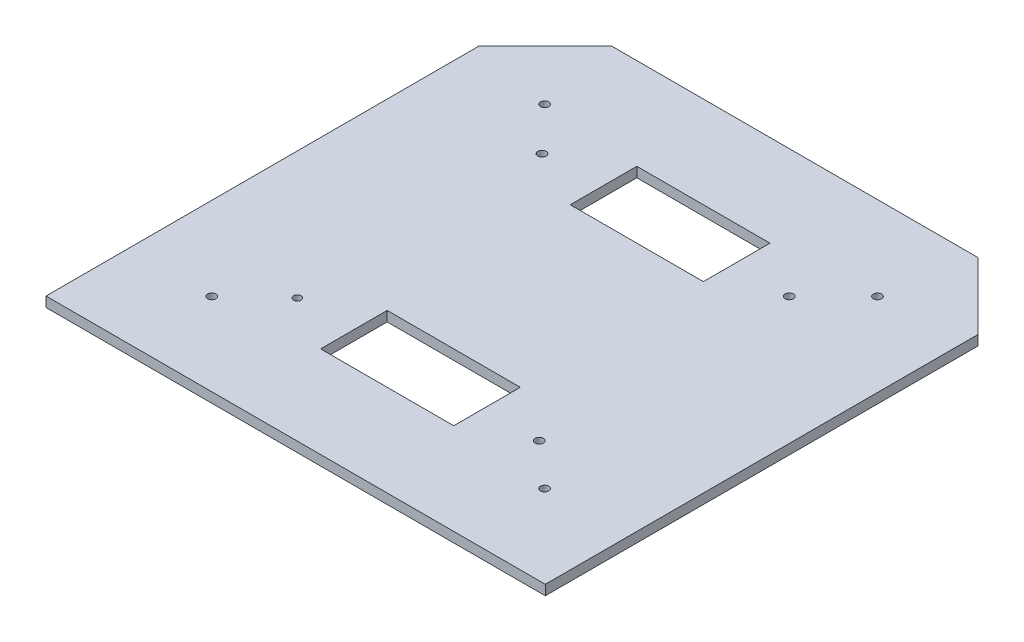
ISO-10303-21;
HEADER;
FILE_DESCRIPTION(('STEP AP214'),'2;1');
FILE_NAME('part.step','',(''),(''),'','','');
FILE_SCHEMA(('AUTOMOTIVE_DESIGN { 1 0 10303 214 1 1 1 1 }'));
ENDSEC;
DATA;
#1=APPLICATION_CONTEXT('core data for automotive mechanical design processes');
#2=APPLICATION_PROTOCOL_DEFINITION('international standard','automotive_design',2000,#1);
#3=PRODUCT_CONTEXT('',#1,'mechanical');
#4=PRODUCT('Part','Part','',(#3));
#5=PRODUCT_RELATED_PRODUCT_CATEGORY('part','',(#4));
#6=PRODUCT_DEFINITION_FORMATION('','',#4);
#7=PRODUCT_DEFINITION_CONTEXT('part definition',#1,'design');
#8=PRODUCT_DEFINITION('design','',#6,#7);
#9=PRODUCT_DEFINITION_SHAPE('','',#8);
#10=(LENGTH_UNIT() NAMED_UNIT(*) SI_UNIT(.MILLI.,.METRE.));
#11=(NAMED_UNIT(*) PLANE_ANGLE_UNIT() SI_UNIT($,.RADIAN.));
#12=(NAMED_UNIT(*) SI_UNIT($,.STERADIAN.) SOLID_ANGLE_UNIT());
#13=UNCERTAINTY_MEASURE_WITH_UNIT(LENGTH_MEASURE(1.E-05),#10,'distance_accuracy_value','');
#14=(GEOMETRIC_REPRESENTATION_CONTEXT(3) GLOBAL_UNCERTAINTY_ASSIGNED_CONTEXT((#13)) GLOBAL_UNIT_ASSIGNED_CONTEXT((#10,
#11,#12)) REPRESENTATION_CONTEXT('',''));
#15=CARTESIAN_POINT('',(0.,0.,0.));
#16=DIRECTION('',(0.,0.,1.));
#17=DIRECTION('',(1.,0.,0.));
#18=AXIS2_PLACEMENT_3D('',#15,#16,#17);
#19=CARTESIAN_POINT('',(0.,6.,0.));
#20=DIRECTION('',(0.,1.,0.));
#21=DIRECTION('',(0.,0.,1.));
#22=AXIS2_PLACEMENT_3D('',#19,#20,#21);
#23=PLANE('',#22);
#24=CARTESIAN_POINT('',(73.4834957055044,6.,-72.8652122212177));
#25=DIRECTION('',(0.,1.,0.));
#26=DIRECTION('',(0.,0.,1.));
#27=AXIS2_PLACEMENT_3D('',#24,#25,#26);
#28=CIRCLE('',#27,2.5);
#29=CARTESIAN_POINT('',(73.4834957055044,6.,-70.3652122212177));
#30=VERTEX_POINT('',#29);
#31=EDGE_CURVE('E565',#30,#30,#28,.T.);
#32=ORIENTED_EDGE('',*,*,#31,.F.);
#33=EDGE_LOOP('',(#32));
#34=FACE_BOUND('',#33,.T.);
#35=CARTESIAN_POINT('',(100.,6.,-249.602322280754));
#36=DIRECTION('',(0.,1.,0.));
#37=DIRECTION('',(0.,0.,1.));
#38=AXIS2_PLACEMENT_3D('',#35,#36,#37);
#39=CIRCLE('',#38,2.49999999999999);
#40=CARTESIAN_POINT('',(100.,6.,-247.102322280754));
#41=VERTEX_POINT('',#40);
#42=EDGE_CURVE('E560',#41,#41,#39,.T.);
#43=ORIENTED_EDGE('',*,*,#42,.F.);
#44=EDGE_LOOP('',(#43));
#45=FACE_BOUND('',#44,.T.);
#46=CARTESIAN_POINT('',(73.4834957055045,6.,-223.085817986259));
#47=DIRECTION('',(0.,1.,0.));
#48=DIRECTION('',(0.,0.,1.));
#49=AXIS2_PLACEMENT_3D('',#46,#47,#48);
#50=CIRCLE('',#49,2.50000000000001);
#51=CARTESIAN_POINT('',(73.4834957055045,6.,-220.585817986259));
#52=VERTEX_POINT('',#51);
#53=EDGE_CURVE('E540',#52,#52,#50,.T.);
#54=ORIENTED_EDGE('',*,*,#53,.F.);
#55=EDGE_LOOP('',(#54));
#56=FACE_BOUND('',#55,.T.);
#57=CARTESIAN_POINT('',(-75.031111772733,6.,-223.085817986259));
#58=DIRECTION('',(0.,1.,0.));
#59=DIRECTION('',(0.,0.,1.));
#60=AXIS2_PLACEMENT_3D('',#57,#58,#59);
#61=CIRCLE('',#60,2.50000000000001);
#62=CARTESIAN_POINT('',(-75.031111772733,6.,-220.585817986259));
#63=VERTEX_POINT('',#62);
#64=EDGE_CURVE('E559',#63,#63,#61,.T.);
#65=ORIENTED_EDGE('',*,*,#64,.F.);
#66=EDGE_LOOP('',(#65));
#67=FACE_BOUND('',#66,.T.);
#68=CARTESIAN_POINT('',(100.,6.,-49.6023222807544));
#69=DIRECTION('',(0.,1.,0.));
#70=DIRECTION('',(0.,0.,1.));
#71=AXIS2_PLACEMENT_3D('',#68,#69,#70);
#72=CIRCLE('',#71,2.5);
#73=CARTESIAN_POINT('',(100.,6.,-47.1023222807544));
#74=VERTEX_POINT('',#73);
#75=EDGE_CURVE('E571',#74,#74,#72,.T.);
#76=ORIENTED_EDGE('',*,*,#75,.F.);
#77=EDGE_LOOP('',(#76));
#78=FACE_BOUND('',#77,.T.);
#79=CARTESIAN_POINT('',(-73.4894464433451,6.,-74.4709950422185));
#80=DIRECTION('',(0.,1.,0.));
#81=DIRECTION('',(0.,0.,1.));
#82=AXIS2_PLACEMENT_3D('',#79,#80,#81);
#83=CIRCLE('',#82,2.29999999999999);
#84=CARTESIAN_POINT('',(-73.4894464433451,6.,-72.1709950422185));
#85=VERTEX_POINT('',#84);
#86=EDGE_CURVE('E576',#85,#85,#83,.T.);
#87=ORIENTED_EDGE('',*,*,#86,.F.);
#88=EDGE_LOOP('',(#87));
#89=FACE_BOUND('',#88,.T.);
#90=CARTESIAN_POINT('',(-100.,6.,-49.6023222807544));
#91=DIRECTION('',(0.,1.,0.));
#92=DIRECTION('',(0.,0.,1.));
#93=AXIS2_PLACEMENT_3D('',#90,#91,#92);
#94=CIRCLE('',#93,2.5);
#95=CARTESIAN_POINT('',(-100.,6.,-47.1023222807544));
#96=VERTEX_POINT('',#95);
#97=EDGE_CURVE('E573',#96,#96,#94,.T.);
#98=ORIENTED_EDGE('',*,*,#97,.F.);
#99=EDGE_LOOP('',(#98));
#100=FACE_BOUND('',#99,.T.);
#101=CARTESIAN_POINT('',(-100.,6.,-249.602322280754));
#102=DIRECTION('',(0.,1.,0.));
#103=DIRECTION('',(0.,0.,1.));
#104=AXIS2_PLACEMENT_3D('',#101,#102,#103);
#105=CIRCLE('',#104,2.49999999999999);
#106=CARTESIAN_POINT('',(-100.,6.,-247.102322280754));
#107=VERTEX_POINT('',#106);
#108=EDGE_CURVE('E253',#107,#107,#105,.T.);
#109=ORIENTED_EDGE('',*,*,#108,.F.);
#110=EDGE_LOOP('',(#109));
#111=FACE_BOUND('',#110,.T.);
#112=DIRECTION('',(1.,0.,0.));
#113=VECTOR('',#112,1.);
#114=CARTESIAN_POINT('',(-150.,6.,0.));
#115=LINE('',#114,#113);
#116=CARTESIAN_POINT('',(-150.,6.,0.));
#117=VERTEX_POINT('',#116);
#118=CARTESIAN_POINT('',(150.,6.,0.));
#119=VERTEX_POINT('',#118);
#120=EDGE_CURVE('E210',#117,#119,#115,.T.);
#121=ORIENTED_EDGE('',*,*,#120,.T.);
#122=DIRECTION('',(0.,0.,-1.));
#123=VECTOR('',#122,1.);
#124=CARTESIAN_POINT('',(150.,6.,0.));
#125=LINE('',#124,#123);
#126=CARTESIAN_POINT('',(150.,6.,-260.));
#127=VERTEX_POINT('',#126);
#128=EDGE_CURVE('E213',#119,#127,#125,.T.);
#129=ORIENTED_EDGE('',*,*,#128,.T.);
#130=DIRECTION('',(-0.707106781186548,0.,-0.707106781186548));
#131=VECTOR('',#130,1.);
#132=CARTESIAN_POINT('',(110.,6.,-300.));
#133=LINE('',#132,#131);
#134=CARTESIAN_POINT('',(110.,6.,-300.));
#135=VERTEX_POINT('',#134);
#136=EDGE_CURVE('E216',#127,#135,#133,.T.);
#137=ORIENTED_EDGE('',*,*,#136,.T.);
#138=DIRECTION('',(-1.,0.,0.));
#139=VECTOR('',#138,1.);
#140=CARTESIAN_POINT('',(-110.,6.,-300.));
#141=LINE('',#140,#139);
#142=CARTESIAN_POINT('',(-110.,6.,-300.));
#143=VERTEX_POINT('',#142);
#144=EDGE_CURVE('E218',#135,#143,#141,.T.);
#145=ORIENTED_EDGE('',*,*,#144,.T.);
#146=DIRECTION('',(-0.707106781186548,0.,0.707106781186548));
#147=VECTOR('',#146,1.);
#148=CARTESIAN_POINT('',(-150.,6.,-260.));
#149=LINE('',#148,#147);
#150=CARTESIAN_POINT('',(-150.,6.,-260.));
#151=VERTEX_POINT('',#150);
#152=EDGE_CURVE('E220',#143,#151,#149,.T.);
#153=ORIENTED_EDGE('',*,*,#152,.T.);
#154=DIRECTION('',(0.,0.,1.));
#155=VECTOR('',#154,1.);
#156=CARTESIAN_POINT('',(-150.,6.,0.));
#157=LINE('',#156,#155);
#158=EDGE_CURVE('E222',#151,#117,#157,.T.);
#159=ORIENTED_EDGE('',*,*,#158,.T.);
#160=EDGE_LOOP('',(#121,#129,#137,#145,#153,#159));
#161=FACE_BOUND('',#160,.T.);
#162=DIRECTION('',(-1.,0.,0.));
#163=VECTOR('',#162,1.);
#164=CARTESIAN_POINT('',(-40.,6.,-95.));
#165=LINE('',#164,#163);
#166=CARTESIAN_POINT('',(40.,6.,-95.));
#167=VERTEX_POINT('',#166);
#168=CARTESIAN_POINT('',(-40.,6.,-95.));
#169=VERTEX_POINT('',#168);
#170=EDGE_CURVE('E181',#167,#169,#165,.T.);
#171=ORIENTED_EDGE('',*,*,#170,.F.);
#172=DIRECTION('',(0.,0.,-1.));
#173=VECTOR('',#172,1.);
#174=CARTESIAN_POINT('',(40.,6.,-95.));
#175=LINE('',#174,#173);
#176=CARTESIAN_POINT('',(40.,6.,-55.));
#177=VERTEX_POINT('',#176);
#178=EDGE_CURVE('E179',#177,#167,#175,.T.);
#179=ORIENTED_EDGE('',*,*,#178,.F.);
#180=DIRECTION('',(1.,0.,0.));
#181=VECTOR('',#180,1.);
#182=CARTESIAN_POINT('',(40.,6.,-55.));
#183=LINE('',#182,#181);
#184=CARTESIAN_POINT('',(-40.,6.,-55.));
#185=VERTEX_POINT('',#184);
#186=EDGE_CURVE('E187',#185,#177,#183,.T.);
#187=ORIENTED_EDGE('',*,*,#186,.F.);
#188=DIRECTION('',(0.,0.,1.));
#189=VECTOR('',#188,1.);
#190=CARTESIAN_POINT('',(-40.,6.,-55.));
#191=LINE('',#190,#189);
#192=EDGE_CURVE('E184',#169,#185,#191,.T.);
#193=ORIENTED_EDGE('',*,*,#192,.F.);
#194=EDGE_LOOP('',(#171,#179,#187,#193));
#195=FACE_BOUND('',#194,.T.);
#196=DIRECTION('',(-1.,0.,0.));
#197=VECTOR('',#196,1.);
#198=CARTESIAN_POINT('',(40.,6.,-245.));
#199=LINE('',#198,#197);
#200=CARTESIAN_POINT('',(40.,6.,-245.));
#201=VERTEX_POINT('',#200);
#202=CARTESIAN_POINT('',(-40.,6.,-245.));
#203=VERTEX_POINT('',#202);
#204=EDGE_CURVE('E150',#201,#203,#199,.T.);
#205=ORIENTED_EDGE('',*,*,#204,.F.);
#206=DIRECTION('',(0.,0.,-1.));
#207=VECTOR('',#206,1.);
#208=CARTESIAN_POINT('',(40.,6.,-205.));
#209=LINE('',#208,#207);
#210=CARTESIAN_POINT('',(40.,6.,-205.));
#211=VERTEX_POINT('',#210);
#212=EDGE_CURVE('E142',#211,#201,#209,.T.);
#213=ORIENTED_EDGE('',*,*,#212,.F.);
#214=DIRECTION('',(1.,0.,0.));
#215=VECTOR('',#214,1.);
#216=CARTESIAN_POINT('',(-40.,6.,-205.));
#217=LINE('',#216,#215);
#218=CARTESIAN_POINT('',(-40.,6.,-205.));
#219=VERTEX_POINT('',#218);
#220=EDGE_CURVE('E164',#219,#211,#217,.T.);
#221=ORIENTED_EDGE('',*,*,#220,.F.);
#222=DIRECTION('',(0.,0.,1.));
#223=VECTOR('',#222,1.);
#224=CARTESIAN_POINT('',(-40.,6.,-245.));
#225=LINE('',#224,#223);
#226=EDGE_CURVE('E162',#203,#219,#225,.T.);
#227=ORIENTED_EDGE('',*,*,#226,.F.);
#228=EDGE_LOOP('',(#205,#213,#221,#227));
#229=FACE_BOUND('',#228,.T.);
#230=ADVANCED_FACE('F39',(#34,#45,#56,#67,#78,#89,#100,#111,#161,#195,#229),#23,.T.);
#231=CARTESIAN_POINT('',(0.,0.,0.));
#232=DIRECTION('',(0.,1.,0.));
#233=DIRECTION('',(0.,0.,1.));
#234=AXIS2_PLACEMENT_3D('',#231,#232,#233);
#235=PLANE('',#234);
#236=CARTESIAN_POINT('',(73.4834957055044,0.,-72.8652122212177));
#237=DIRECTION('',(0.,1.,0.));
#238=DIRECTION('',(0.,0.,1.));
#239=AXIS2_PLACEMENT_3D('',#236,#237,#238);
#240=CIRCLE('',#239,2.5);
#241=CARTESIAN_POINT('',(73.4834957055044,0.,-70.3652122212177));
#242=VERTEX_POINT('',#241);
#243=EDGE_CURVE('E43',#242,#242,#240,.T.);
#244=ORIENTED_EDGE('',*,*,#243,.T.);
#245=EDGE_LOOP('',(#244));
#246=FACE_BOUND('',#245,.T.);
#247=CARTESIAN_POINT('',(100.,0.,-249.602322280754));
#248=DIRECTION('',(0.,1.,0.));
#249=DIRECTION('',(0.,0.,1.));
#250=AXIS2_PLACEMENT_3D('',#247,#248,#249);
#251=CIRCLE('',#250,2.49999999999999);
#252=CARTESIAN_POINT('',(100.,0.,-247.102322280754));
#253=VERTEX_POINT('',#252);
#254=EDGE_CURVE('E267',#253,#253,#251,.T.);
#255=ORIENTED_EDGE('',*,*,#254,.T.);
#256=EDGE_LOOP('',(#255));
#257=FACE_BOUND('',#256,.T.);
#258=CARTESIAN_POINT('',(73.4834957055045,0.,-223.085817986259));
#259=DIRECTION('',(0.,1.,0.));
#260=DIRECTION('',(0.,0.,1.));
#261=AXIS2_PLACEMENT_3D('',#258,#259,#260);
#262=CIRCLE('',#261,2.50000000000001);
#263=CARTESIAN_POINT('',(73.4834957055045,0.,-220.585817986259));
#264=VERTEX_POINT('',#263);
#265=EDGE_CURVE('E265',#264,#264,#262,.T.);
#266=ORIENTED_EDGE('',*,*,#265,.T.);
#267=EDGE_LOOP('',(#266));
#268=FACE_BOUND('',#267,.T.);
#269=CARTESIAN_POINT('',(-75.031111772733,0.,-223.085817986259));
#270=DIRECTION('',(0.,1.,0.));
#271=DIRECTION('',(0.,0.,1.));
#272=AXIS2_PLACEMENT_3D('',#269,#270,#271);
#273=CIRCLE('',#272,2.50000000000001);
#274=CARTESIAN_POINT('',(-75.031111772733,0.,-220.585817986259));
#275=VERTEX_POINT('',#274);
#276=EDGE_CURVE('E262',#275,#275,#273,.T.);
#277=ORIENTED_EDGE('',*,*,#276,.T.);
#278=EDGE_LOOP('',(#277));
#279=FACE_BOUND('',#278,.T.);
#280=CARTESIAN_POINT('',(100.,0.,-49.6023222807544));
#281=DIRECTION('',(0.,1.,0.));
#282=DIRECTION('',(0.,0.,1.));
#283=AXIS2_PLACEMENT_3D('',#280,#281,#282);
#284=CIRCLE('',#283,2.5);
#285=CARTESIAN_POINT('',(100.,0.,-47.1023222807544));
#286=VERTEX_POINT('',#285);
#287=EDGE_CURVE('E259',#286,#286,#284,.T.);
#288=ORIENTED_EDGE('',*,*,#287,.T.);
#289=EDGE_LOOP('',(#288));
#290=FACE_BOUND('',#289,.T.);
#291=CARTESIAN_POINT('',(-73.4894464433451,0.,-74.4709950422185));
#292=DIRECTION('',(0.,1.,0.));
#293=DIRECTION('',(0.,0.,1.));
#294=AXIS2_PLACEMENT_3D('',#291,#292,#293);
#295=CIRCLE('',#294,2.29999999999999);
#296=CARTESIAN_POINT('',(-73.4894464433451,0.,-72.1709950422185));
#297=VERTEX_POINT('',#296);
#298=EDGE_CURVE('E256',#297,#297,#295,.T.);
#299=ORIENTED_EDGE('',*,*,#298,.T.);
#300=EDGE_LOOP('',(#299));
#301=FACE_BOUND('',#300,.T.);
#302=CARTESIAN_POINT('',(-100.,0.,-49.6023222807544));
#303=DIRECTION('',(0.,1.,0.));
#304=DIRECTION('',(0.,0.,1.));
#305=AXIS2_PLACEMENT_3D('',#302,#303,#304);
#306=CIRCLE('',#305,2.5);
#307=CARTESIAN_POINT('',(-100.,0.,-47.1023222807544));
#308=VERTEX_POINT('',#307);
#309=EDGE_CURVE('E252',#308,#308,#306,.T.);
#310=ORIENTED_EDGE('',*,*,#309,.T.);
#311=EDGE_LOOP('',(#310));
#312=FACE_BOUND('',#311,.T.);
#313=CARTESIAN_POINT('',(-100.,0.,-249.602322280754));
#314=DIRECTION('',(0.,1.,0.));
#315=DIRECTION('',(0.,0.,1.));
#316=AXIS2_PLACEMENT_3D('',#313,#314,#315);
#317=CIRCLE('',#316,2.49999999999999);
#318=CARTESIAN_POINT('',(-100.,0.,-247.102322280754));
#319=VERTEX_POINT('',#318);
#320=EDGE_CURVE('E249',#319,#319,#317,.T.);
#321=ORIENTED_EDGE('',*,*,#320,.T.);
#322=EDGE_LOOP('',(#321));
#323=FACE_BOUND('',#322,.T.);
#324=DIRECTION('',(0.,0.,-1.));
#325=VECTOR('',#324,1.);
#326=CARTESIAN_POINT('',(40.,0.,-95.));
#327=LINE('',#326,#325);
#328=CARTESIAN_POINT('',(40.,0.,-55.));
#329=VERTEX_POINT('',#328);
#330=CARTESIAN_POINT('',(40.,0.,-95.));
#331=VERTEX_POINT('',#330);
#332=EDGE_CURVE('E158',#329,#331,#327,.T.);
#333=ORIENTED_EDGE('',*,*,#332,.T.);
#334=DIRECTION('',(-1.,0.,0.));
#335=VECTOR('',#334,1.);
#336=CARTESIAN_POINT('',(-40.,0.,-95.));
#337=LINE('',#336,#335);
#338=CARTESIAN_POINT('',(-40.,0.,-95.));
#339=VERTEX_POINT('',#338);
#340=EDGE_CURVE('E192',#331,#339,#337,.T.);
#341=ORIENTED_EDGE('',*,*,#340,.T.);
#342=DIRECTION('',(0.,0.,1.));
#343=VECTOR('',#342,1.);
#344=CARTESIAN_POINT('',(-40.,0.,-55.));
#345=LINE('',#344,#343);
#346=CARTESIAN_POINT('',(-40.,0.,-55.));
#347=VERTEX_POINT('',#346);
#348=EDGE_CURVE('E195',#339,#347,#345,.T.);
#349=ORIENTED_EDGE('',*,*,#348,.T.);
#350=DIRECTION('',(1.,0.,0.));
#351=VECTOR('',#350,1.);
#352=CARTESIAN_POINT('',(40.,0.,-55.));
#353=LINE('',#352,#351);
#354=EDGE_CURVE('E182',#347,#329,#353,.T.);
#355=ORIENTED_EDGE('',*,*,#354,.T.);
#356=EDGE_LOOP('',(#333,#341,#349,#355));
#357=FACE_BOUND('',#356,.T.);
#358=DIRECTION('',(1.,0.,0.));
#359=VECTOR('',#358,1.);
#360=CARTESIAN_POINT('',(-150.,0.,0.));
#361=LINE('',#360,#359);
#362=CARTESIAN_POINT('',(-150.,0.,0.));
#363=VERTEX_POINT('',#362);
#364=CARTESIAN_POINT('',(150.,0.,0.));
#365=VERTEX_POINT('',#364);
#366=EDGE_CURVE('E209',#363,#365,#361,.T.);
#367=ORIENTED_EDGE('',*,*,#366,.F.);
#368=DIRECTION('',(0.,0.,1.));
#369=VECTOR('',#368,1.);
#370=CARTESIAN_POINT('',(-150.,0.,0.));
#371=LINE('',#370,#369);
#372=CARTESIAN_POINT('',(-150.,0.,-260.));
#373=VERTEX_POINT('',#372);
#374=EDGE_CURVE('E214',#373,#363,#371,.T.);
#375=ORIENTED_EDGE('',*,*,#374,.F.);
#376=DIRECTION('',(-0.707106781186548,0.,0.707106781186548));
#377=VECTOR('',#376,1.);
#378=CARTESIAN_POINT('',(-150.,0.,-260.));
#379=LINE('',#378,#377);
#380=CARTESIAN_POINT('',(-110.,0.,-300.));
#381=VERTEX_POINT('',#380);
#382=EDGE_CURVE('E233',#381,#373,#379,.T.);
#383=ORIENTED_EDGE('',*,*,#382,.F.);
#384=DIRECTION('',(-1.,0.,0.));
#385=VECTOR('',#384,1.);
#386=CARTESIAN_POINT('',(-110.,0.,-300.));
#387=LINE('',#386,#385);
#388=CARTESIAN_POINT('',(110.,0.,-300.));
#389=VERTEX_POINT('',#388);
#390=EDGE_CURVE('E231',#389,#381,#387,.T.);
#391=ORIENTED_EDGE('',*,*,#390,.F.);
#392=DIRECTION('',(-0.707106781186548,0.,-0.707106781186548));
#393=VECTOR('',#392,1.);
#394=CARTESIAN_POINT('',(110.,0.,-300.));
#395=LINE('',#394,#393);
#396=CARTESIAN_POINT('',(150.,0.,-260.));
#397=VERTEX_POINT('',#396);
#398=EDGE_CURVE('E229',#397,#389,#395,.T.);
#399=ORIENTED_EDGE('',*,*,#398,.F.);
#400=DIRECTION('',(0.,0.,-1.));
#401=VECTOR('',#400,1.);
#402=CARTESIAN_POINT('',(150.,0.,0.));
#403=LINE('',#402,#401);
#404=EDGE_CURVE('E227',#365,#397,#403,.T.);
#405=ORIENTED_EDGE('',*,*,#404,.F.);
#406=EDGE_LOOP('',(#367,#375,#383,#391,#399,#405));
#407=FACE_BOUND('',#406,.T.);
#408=DIRECTION('',(0.,0.,-1.));
#409=VECTOR('',#408,1.);
#410=CARTESIAN_POINT('',(40.,0.,-205.));
#411=LINE('',#410,#409);
#412=CARTESIAN_POINT('',(40.,0.,-205.));
#413=VERTEX_POINT('',#412);
#414=CARTESIAN_POINT('',(40.,0.,-245.));
#415=VERTEX_POINT('',#414);
#416=EDGE_CURVE('E64',#413,#415,#411,.T.);
#417=ORIENTED_EDGE('',*,*,#416,.T.);
#418=DIRECTION('',(-1.,0.,0.));
#419=VECTOR('',#418,1.);
#420=CARTESIAN_POINT('',(40.,0.,-245.));
#421=LINE('',#420,#419);
#422=CARTESIAN_POINT('',(-40.,0.,-245.));
#423=VERTEX_POINT('',#422);
#424=EDGE_CURVE('E157',#415,#423,#421,.T.);
#425=ORIENTED_EDGE('',*,*,#424,.T.);
#426=DIRECTION('',(0.,0.,1.));
#427=VECTOR('',#426,1.);
#428=CARTESIAN_POINT('',(-40.,0.,-245.));
#429=LINE('',#428,#427);
#430=CARTESIAN_POINT('',(-40.,0.,-205.));
#431=VERTEX_POINT('',#430);
#432=EDGE_CURVE('E171',#423,#431,#429,.T.);
#433=ORIENTED_EDGE('',*,*,#432,.T.);
#434=DIRECTION('',(1.,0.,0.));
#435=VECTOR('',#434,1.);
#436=CARTESIAN_POINT('',(-40.,0.,-205.));
#437=LINE('',#436,#435);
#438=EDGE_CURVE('E151',#431,#413,#437,.T.);
#439=ORIENTED_EDGE('',*,*,#438,.T.);
#440=EDGE_LOOP('',(#417,#425,#433,#439));
#441=FACE_BOUND('',#440,.T.);
#442=ADVANCED_FACE('F274',(#246,#257,#268,#279,#290,#301,#312,#323,#357,#407,#441),#235,.F.);
#443=CARTESIAN_POINT('',(-150.,6.,0.));
#444=DIRECTION('',(0.,0.,-1.));
#445=DIRECTION('',(-1.,0.,0.));
#446=AXIS2_PLACEMENT_3D('',#443,#444,#445);
#447=PLANE('',#446);
#448=ORIENTED_EDGE('',*,*,#366,.T.);
#449=DIRECTION('',(0.,-1.,0.));
#450=VECTOR('',#449,1.);
#451=CARTESIAN_POINT('',(150.,6.,0.));
#452=LINE('',#451,#450);
#453=EDGE_CURVE('E11',#119,#365,#452,.T.);
#454=ORIENTED_EDGE('',*,*,#453,.F.);
#455=ORIENTED_EDGE('',*,*,#120,.F.);
#456=DIRECTION('',(0.,-1.,0.));
#457=VECTOR('',#456,1.);
#458=CARTESIAN_POINT('',(-150.,6.,0.));
#459=LINE('',#458,#457);
#460=EDGE_CURVE('E224',#117,#363,#459,.T.);
#461=ORIENTED_EDGE('',*,*,#460,.T.);
#462=EDGE_LOOP('',(#448,#454,#455,#461));
#463=FACE_BOUND('',#462,.T.);
#464=ADVANCED_FACE('F41',(#463),#447,.F.);
#465=CARTESIAN_POINT('',(150.,6.,0.));
#466=DIRECTION('',(-1.,0.,0.));
#467=DIRECTION('',(0.,0.,1.));
#468=AXIS2_PLACEMENT_3D('',#465,#466,#467);
#469=PLANE('',#468);
#470=ORIENTED_EDGE('',*,*,#404,.T.);
#471=DIRECTION('',(0.,-1.,0.));
#472=VECTOR('',#471,1.);
#473=CARTESIAN_POINT('',(150.,6.,-260.));
#474=LINE('',#473,#472);
#475=EDGE_CURVE('E48',#127,#397,#474,.T.);
#476=ORIENTED_EDGE('',*,*,#475,.F.);
#477=ORIENTED_EDGE('',*,*,#128,.F.);
#478=ORIENTED_EDGE('',*,*,#453,.T.);
#479=EDGE_LOOP('',(#470,#476,#477,#478));
#480=FACE_BOUND('',#479,.T.);
#481=ADVANCED_FACE('F316',(#480),#469,.F.);
#482=CARTESIAN_POINT('',(110.,6.,-300.));
#483=DIRECTION('',(-0.707106781186547,0.,0.707106781186547));
#484=DIRECTION('',(0.707106781186548,0.,0.707106781186548));
#485=AXIS2_PLACEMENT_3D('',#482,#483,#484);
#486=PLANE('',#485);
#487=ORIENTED_EDGE('',*,*,#398,.T.);
#488=DIRECTION('',(0.,-1.,0.));
#489=VECTOR('',#488,1.);
#490=CARTESIAN_POINT('',(110.,6.,-300.));
#491=LINE('',#490,#489);
#492=EDGE_CURVE('E244',#135,#389,#491,.T.);
#493=ORIENTED_EDGE('',*,*,#492,.F.);
#494=ORIENTED_EDGE('',*,*,#136,.F.);
#495=ORIENTED_EDGE('',*,*,#475,.T.);
#496=EDGE_LOOP('',(#487,#493,#494,#495));
#497=FACE_BOUND('',#496,.T.);
#498=ADVANCED_FACE('F313',(#497),#486,.F.);
#499=CARTESIAN_POINT('',(-110.,6.,-300.));
#500=DIRECTION('',(0.,0.,1.));
#501=DIRECTION('',(1.,0.,0.));
#502=AXIS2_PLACEMENT_3D('',#499,#500,#501);
#503=PLANE('',#502);
#504=ORIENTED_EDGE('',*,*,#390,.T.);
#505=DIRECTION('',(0.,-1.,0.));
#506=VECTOR('',#505,1.);
#507=CARTESIAN_POINT('',(-110.,6.,-300.));
#508=LINE('',#507,#506);
#509=EDGE_CURVE('E241',#143,#381,#508,.T.);
#510=ORIENTED_EDGE('',*,*,#509,.F.);
#511=ORIENTED_EDGE('',*,*,#144,.F.);
#512=ORIENTED_EDGE('',*,*,#492,.T.);
#513=EDGE_LOOP('',(#504,#510,#511,#512));
#514=FACE_BOUND('',#513,.T.);
#515=ADVANCED_FACE('F309',(#514),#503,.F.);
#516=CARTESIAN_POINT('',(-150.,6.,-260.));
#517=DIRECTION('',(0.707106781186547,0.,0.707106781186547));
#518=DIRECTION('',(0.707106781186548,0.,-0.707106781186548));
#519=AXIS2_PLACEMENT_3D('',#516,#517,#518);
#520=PLANE('',#519);
#521=ORIENTED_EDGE('',*,*,#382,.T.);
#522=DIRECTION('',(0.,-1.,0.));
#523=VECTOR('',#522,1.);
#524=CARTESIAN_POINT('',(-150.,6.,-260.));
#525=LINE('',#524,#523);
#526=EDGE_CURVE('E238',#151,#373,#525,.T.);
#527=ORIENTED_EDGE('',*,*,#526,.F.);
#528=ORIENTED_EDGE('',*,*,#152,.F.);
#529=ORIENTED_EDGE('',*,*,#509,.T.);
#530=EDGE_LOOP('',(#521,#527,#528,#529));
#531=FACE_BOUND('',#530,.T.);
#532=ADVANCED_FACE('F305',(#531),#520,.F.);
#533=CARTESIAN_POINT('',(-150.,6.,0.));
#534=DIRECTION('',(1.,0.,0.));
#535=DIRECTION('',(0.,0.,-1.));
#536=AXIS2_PLACEMENT_3D('',#533,#534,#535);
#537=PLANE('',#536);
#538=ORIENTED_EDGE('',*,*,#374,.T.);
#539=ORIENTED_EDGE('',*,*,#460,.F.);
#540=ORIENTED_EDGE('',*,*,#158,.F.);
#541=ORIENTED_EDGE('',*,*,#526,.T.);
#542=EDGE_LOOP('',(#538,#539,#540,#541));
#543=FACE_BOUND('',#542,.T.);
#544=ADVANCED_FACE('F302',(#543),#537,.F.);
#545=CARTESIAN_POINT('',(40.,6.,-95.));
#546=DIRECTION('',(-1.,0.,0.));
#547=DIRECTION('',(0.,0.,1.));
#548=AXIS2_PLACEMENT_3D('',#545,#546,#547);
#549=PLANE('',#548);
#550=ORIENTED_EDGE('',*,*,#332,.F.);
#551=DIRECTION('',(0.,-1.,0.));
#552=VECTOR('',#551,1.);
#553=CARTESIAN_POINT('',(40.,6.,-55.));
#554=LINE('',#553,#552);
#555=EDGE_CURVE('E189',#177,#329,#554,.T.);
#556=ORIENTED_EDGE('',*,*,#555,.F.);
#557=ORIENTED_EDGE('',*,*,#178,.T.);
#558=DIRECTION('',(0.,-1.,0.));
#559=VECTOR('',#558,1.);
#560=CARTESIAN_POINT('',(40.,6.,-95.));
#561=LINE('',#560,#559);
#562=EDGE_CURVE('E206',#167,#331,#561,.T.);
#563=ORIENTED_EDGE('',*,*,#562,.T.);
#564=EDGE_LOOP('',(#550,#556,#557,#563));
#565=FACE_BOUND('',#564,.T.);
#566=ADVANCED_FACE('F299',(#565),#549,.T.);
#567=CARTESIAN_POINT('',(-40.,6.,-95.));
#568=DIRECTION('',(0.,0.,1.));
#569=DIRECTION('',(1.,0.,0.));
#570=AXIS2_PLACEMENT_3D('',#567,#568,#569);
#571=PLANE('',#570);
#572=ORIENTED_EDGE('',*,*,#340,.F.);
#573=ORIENTED_EDGE('',*,*,#562,.F.);
#574=ORIENTED_EDGE('',*,*,#170,.T.);
#575=DIRECTION('',(0.,-1.,0.));
#576=VECTOR('',#575,1.);
#577=CARTESIAN_POINT('',(-40.,6.,-95.));
#578=LINE('',#577,#576);
#579=EDGE_CURVE('E204',#169,#339,#578,.T.);
#580=ORIENTED_EDGE('',*,*,#579,.T.);
#581=EDGE_LOOP('',(#572,#573,#574,#580));
#582=FACE_BOUND('',#581,.T.);
#583=ADVANCED_FACE('F351',(#582),#571,.T.);
#584=CARTESIAN_POINT('',(-40.,6.,-55.));
#585=DIRECTION('',(1.,0.,0.));
#586=DIRECTION('',(0.,0.,-1.));
#587=AXIS2_PLACEMENT_3D('',#584,#585,#586);
#588=PLANE('',#587);
#589=ORIENTED_EDGE('',*,*,#348,.F.);
#590=ORIENTED_EDGE('',*,*,#579,.F.);
#591=ORIENTED_EDGE('',*,*,#192,.T.);
#592=DIRECTION('',(0.,-1.,0.));
#593=VECTOR('',#592,1.);
#594=CARTESIAN_POINT('',(-40.,6.,-55.));
#595=LINE('',#594,#593);
#596=EDGE_CURVE('E202',#185,#347,#595,.T.);
#597=ORIENTED_EDGE('',*,*,#596,.T.);
#598=EDGE_LOOP('',(#589,#590,#591,#597));
#599=FACE_BOUND('',#598,.T.);
#600=ADVANCED_FACE('F354',(#599),#588,.T.);
#601=CARTESIAN_POINT('',(40.,6.,-55.));
#602=DIRECTION('',(0.,0.,-1.));
#603=DIRECTION('',(-1.,0.,0.));
#604=AXIS2_PLACEMENT_3D('',#601,#602,#603);
#605=PLANE('',#604);
#606=ORIENTED_EDGE('',*,*,#354,.F.);
#607=ORIENTED_EDGE('',*,*,#596,.F.);
#608=ORIENTED_EDGE('',*,*,#186,.T.);
#609=ORIENTED_EDGE('',*,*,#555,.T.);
#610=EDGE_LOOP('',(#606,#607,#608,#609));
#611=FACE_BOUND('',#610,.T.);
#612=ADVANCED_FACE('F360',(#611),#605,.T.);
#613=CARTESIAN_POINT('',(40.,6.,-205.));
#614=DIRECTION('',(-1.,0.,0.));
#615=DIRECTION('',(0.,0.,1.));
#616=AXIS2_PLACEMENT_3D('',#613,#614,#615);
#617=PLANE('',#616);
#618=ORIENTED_EDGE('',*,*,#416,.F.);
#619=DIRECTION('',(0.,-1.,0.));
#620=VECTOR('',#619,1.);
#621=CARTESIAN_POINT('',(40.,6.,-205.));
#622=LINE('',#621,#620);
#623=EDGE_CURVE('E146',#211,#413,#622,.T.);
#624=ORIENTED_EDGE('',*,*,#623,.F.);
#625=ORIENTED_EDGE('',*,*,#212,.T.);
#626=DIRECTION('',(0.,-1.,0.));
#627=VECTOR('',#626,1.);
#628=CARTESIAN_POINT('',(40.,6.,-245.));
#629=LINE('',#628,#627);
#630=EDGE_CURVE('E145',#201,#415,#629,.T.);
#631=ORIENTED_EDGE('',*,*,#630,.T.);
#632=EDGE_LOOP('',(#618,#624,#625,#631));
#633=FACE_BOUND('',#632,.T.);
#634=ADVANCED_FACE('F144',(#633),#617,.T.);
#635=CARTESIAN_POINT('',(40.,6.,-245.));
#636=DIRECTION('',(0.,0.,1.));
#637=DIRECTION('',(1.,0.,0.));
#638=AXIS2_PLACEMENT_3D('',#635,#636,#637);
#639=PLANE('',#638);
#640=ORIENTED_EDGE('',*,*,#424,.F.);
#641=ORIENTED_EDGE('',*,*,#630,.F.);
#642=ORIENTED_EDGE('',*,*,#204,.T.);
#643=DIRECTION('',(0.,-1.,0.));
#644=VECTOR('',#643,1.);
#645=CARTESIAN_POINT('',(-40.,6.,-245.));
#646=LINE('',#645,#644);
#647=EDGE_CURVE('E159',#203,#423,#646,.T.);
#648=ORIENTED_EDGE('',*,*,#647,.T.);
#649=EDGE_LOOP('',(#640,#641,#642,#648));
#650=FACE_BOUND('',#649,.T.);
#651=ADVANCED_FACE('F154',(#650),#639,.T.);
#652=CARTESIAN_POINT('',(-40.,6.,-245.));
#653=DIRECTION('',(1.,0.,0.));
#654=DIRECTION('',(0.,0.,-1.));
#655=AXIS2_PLACEMENT_3D('',#652,#653,#654);
#656=PLANE('',#655);
#657=ORIENTED_EDGE('',*,*,#432,.F.);
#658=ORIENTED_EDGE('',*,*,#647,.F.);
#659=ORIENTED_EDGE('',*,*,#226,.T.);
#660=DIRECTION('',(0.,-1.,0.));
#661=VECTOR('',#660,1.);
#662=CARTESIAN_POINT('',(-40.,6.,-205.));
#663=LINE('',#662,#661);
#664=EDGE_CURVE('E56',#219,#431,#663,.T.);
#665=ORIENTED_EDGE('',*,*,#664,.T.);
#666=EDGE_LOOP('',(#657,#658,#659,#665));
#667=FACE_BOUND('',#666,.T.);
#668=ADVANCED_FACE('F490',(#667),#656,.T.);
#669=CARTESIAN_POINT('',(-40.,6.,-205.));
#670=DIRECTION('',(0.,0.,-1.));
#671=DIRECTION('',(-1.,0.,0.));
#672=AXIS2_PLACEMENT_3D('',#669,#670,#671);
#673=PLANE('',#672);
#674=ORIENTED_EDGE('',*,*,#438,.F.);
#675=ORIENTED_EDGE('',*,*,#664,.F.);
#676=ORIENTED_EDGE('',*,*,#220,.T.);
#677=ORIENTED_EDGE('',*,*,#623,.T.);
#678=EDGE_LOOP('',(#674,#675,#676,#677));
#679=FACE_BOUND('',#678,.T.);
#680=ADVANCED_FACE('F422',(#679),#673,.T.);
#681=CARTESIAN_POINT('',(-100.,-29.,-249.602322280754));
#682=DIRECTION('',(0.,1.,0.));
#683=DIRECTION('',(0.,0.,1.));
#684=AXIS2_PLACEMENT_3D('',#681,#682,#683);
#685=CYLINDRICAL_SURFACE('',#684,2.49999999999999);
#686=ORIENTED_EDGE('',*,*,#108,.T.);
#687=EDGE_LOOP('',(#686));
#688=FACE_BOUND('',#687,.T.);
#689=ORIENTED_EDGE('',*,*,#320,.F.);
#690=EDGE_LOOP('',(#689));
#691=FACE_BOUND('',#690,.T.);
#692=ADVANCED_FACE('F416',(#688,#691),#685,.F.);
#693=CARTESIAN_POINT('',(-100.,-29.,-49.6023222807544));
#694=DIRECTION('',(0.,1.,0.));
#695=DIRECTION('',(0.,0.,1.));
#696=AXIS2_PLACEMENT_3D('',#693,#694,#695);
#697=CYLINDRICAL_SURFACE('',#696,2.5);
#698=ORIENTED_EDGE('',*,*,#97,.T.);
#699=EDGE_LOOP('',(#698));
#700=FACE_BOUND('',#699,.T.);
#701=ORIENTED_EDGE('',*,*,#309,.F.);
#702=EDGE_LOOP('',(#701));
#703=FACE_BOUND('',#702,.T.);
#704=ADVANCED_FACE('F421',(#700,#703),#697,.F.);
#705=CARTESIAN_POINT('',(-73.4894464433451,-29.,-74.4709950422185));
#706=DIRECTION('',(0.,1.,0.));
#707=DIRECTION('',(0.,0.,1.));
#708=AXIS2_PLACEMENT_3D('',#705,#706,#707);
#709=CYLINDRICAL_SURFACE('',#708,2.29999999999999);
#710=ORIENTED_EDGE('',*,*,#86,.T.);
#711=EDGE_LOOP('',(#710));
#712=FACE_BOUND('',#711,.T.);
#713=ORIENTED_EDGE('',*,*,#298,.F.);
#714=EDGE_LOOP('',(#713));
#715=FACE_BOUND('',#714,.T.);
#716=ADVANCED_FACE('F434',(#712,#715),#709,.F.);
#717=CARTESIAN_POINT('',(100.,-29.,-49.6023222807544));
#718=DIRECTION('',(0.,1.,0.));
#719=DIRECTION('',(0.,0.,1.));
#720=AXIS2_PLACEMENT_3D('',#717,#718,#719);
#721=CYLINDRICAL_SURFACE('',#720,2.5);
#722=ORIENTED_EDGE('',*,*,#75,.T.);
#723=EDGE_LOOP('',(#722));
#724=FACE_BOUND('',#723,.T.);
#725=ORIENTED_EDGE('',*,*,#287,.F.);
#726=EDGE_LOOP('',(#725));
#727=FACE_BOUND('',#726,.T.);
#728=ADVANCED_FACE('F444',(#724,#727),#721,.F.);
#729=CARTESIAN_POINT('',(-75.031111772733,-29.,-223.085817986259));
#730=DIRECTION('',(0.,1.,0.));
#731=DIRECTION('',(0.,0.,1.));
#732=AXIS2_PLACEMENT_3D('',#729,#730,#731);
#733=CYLINDRICAL_SURFACE('',#732,2.50000000000001);
#734=ORIENTED_EDGE('',*,*,#64,.T.);
#735=EDGE_LOOP('',(#734));
#736=FACE_BOUND('',#735,.T.);
#737=ORIENTED_EDGE('',*,*,#276,.F.);
#738=EDGE_LOOP('',(#737));
#739=FACE_BOUND('',#738,.T.);
#740=ADVANCED_FACE('F454',(#736,#739),#733,.F.);
#741=CARTESIAN_POINT('',(73.4834957055045,-29.,-223.085817986259));
#742=DIRECTION('',(0.,1.,0.));
#743=DIRECTION('',(0.,0.,1.));
#744=AXIS2_PLACEMENT_3D('',#741,#742,#743);
#745=CYLINDRICAL_SURFACE('',#744,2.50000000000001);
#746=ORIENTED_EDGE('',*,*,#53,.T.);
#747=EDGE_LOOP('',(#746));
#748=FACE_BOUND('',#747,.T.);
#749=ORIENTED_EDGE('',*,*,#265,.F.);
#750=EDGE_LOOP('',(#749));
#751=FACE_BOUND('',#750,.T.);
#752=ADVANCED_FACE('F284',(#748,#751),#745,.F.);
#753=CARTESIAN_POINT('',(100.,-29.,-249.602322280754));
#754=DIRECTION('',(0.,1.,0.));
#755=DIRECTION('',(0.,0.,1.));
#756=AXIS2_PLACEMENT_3D('',#753,#754,#755);
#757=CYLINDRICAL_SURFACE('',#756,2.49999999999999);
#758=ORIENTED_EDGE('',*,*,#42,.T.);
#759=EDGE_LOOP('',(#758));
#760=FACE_BOUND('',#759,.T.);
#761=ORIENTED_EDGE('',*,*,#254,.F.);
#762=EDGE_LOOP('',(#761));
#763=FACE_BOUND('',#762,.T.);
#764=ADVANCED_FACE('F278',(#760,#763),#757,.F.);
#765=CARTESIAN_POINT('',(73.4834957055044,-29.,-72.8652122212177));
#766=DIRECTION('',(0.,1.,0.));
#767=DIRECTION('',(0.,0.,1.));
#768=AXIS2_PLACEMENT_3D('',#765,#766,#767);
#769=CYLINDRICAL_SURFACE('',#768,2.5);
#770=ORIENTED_EDGE('',*,*,#31,.T.);
#771=EDGE_LOOP('',(#770));
#772=FACE_BOUND('',#771,.T.);
#773=ORIENTED_EDGE('',*,*,#243,.F.);
#774=EDGE_LOOP('',(#773));
#775=FACE_BOUND('',#774,.T.);
#776=ADVANCED_FACE('F276',(#772,#775),#769,.F.);
#777=CLOSED_SHELL('',(#230,#442,#464,#481,#498,#515,#532,#544,#566,#583,#600,#612,#634,#651,
#668,#680,#692,#704,#716,#728,#740,#752,#764,#776));
#778=MANIFOLD_SOLID_BREP('B2',#777);
#779=ADVANCED_BREP_SHAPE_REPRESENTATION('',(#18,#778),#14);
#780=SHAPE_DEFINITION_REPRESENTATION(#9,#779);
ENDSEC;
END-ISO-10303-21;
